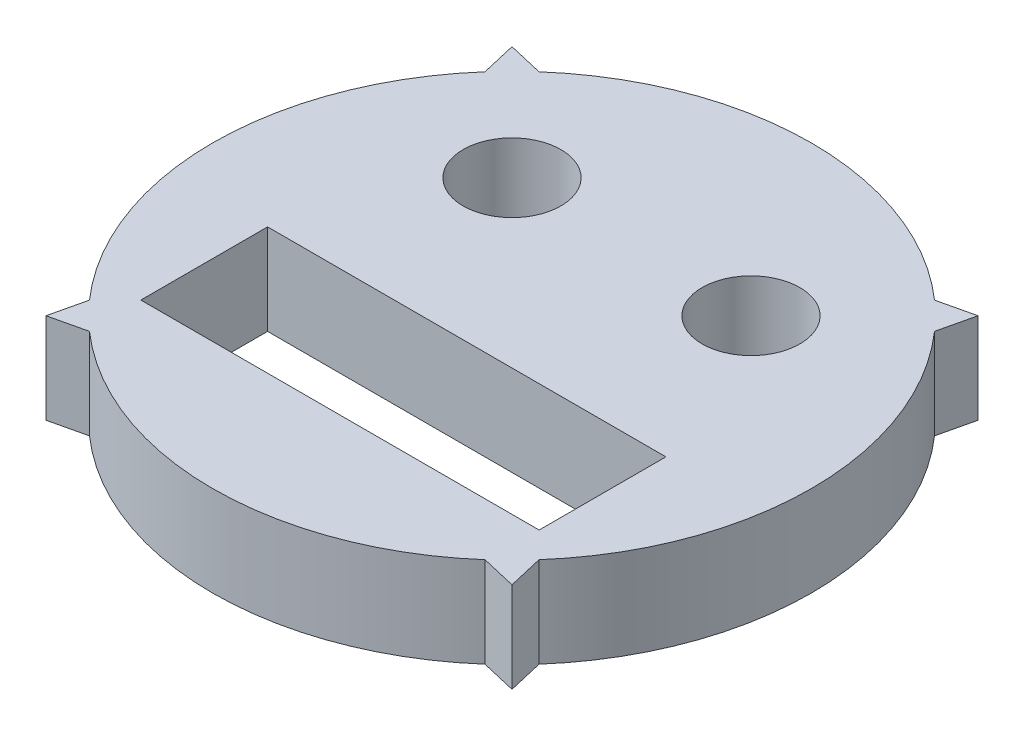
ISO-10303-21;
HEADER;
FILE_DESCRIPTION(('STEP AP214'),'2;1');
FILE_NAME('part.step','',(''),(''),'','','');
FILE_SCHEMA(('AUTOMOTIVE_DESIGN { 1 0 10303 214 1 1 1 1 }'));
ENDSEC;
DATA;
#1=APPLICATION_CONTEXT('core data for automotive mechanical design processes');
#2=APPLICATION_PROTOCOL_DEFINITION('international standard','automotive_design',2000,#1);
#3=PRODUCT_CONTEXT('',#1,'mechanical');
#4=PRODUCT('Part','Part','',(#3));
#5=PRODUCT_RELATED_PRODUCT_CATEGORY('part','',(#4));
#6=PRODUCT_DEFINITION_FORMATION('','',#4);
#7=PRODUCT_DEFINITION_CONTEXT('part definition',#1,'design');
#8=PRODUCT_DEFINITION('design','',#6,#7);
#9=PRODUCT_DEFINITION_SHAPE('','',#8);
#10=(LENGTH_UNIT() NAMED_UNIT(*) SI_UNIT(.MILLI.,.METRE.));
#11=(NAMED_UNIT(*) PLANE_ANGLE_UNIT() SI_UNIT($,.RADIAN.));
#12=(NAMED_UNIT(*) SI_UNIT($,.STERADIAN.) SOLID_ANGLE_UNIT());
#13=UNCERTAINTY_MEASURE_WITH_UNIT(LENGTH_MEASURE(1.E-05),#10,'distance_accuracy_value','');
#14=(GEOMETRIC_REPRESENTATION_CONTEXT(3) GLOBAL_UNCERTAINTY_ASSIGNED_CONTEXT((#13)) GLOBAL_UNIT_ASSIGNED_CONTEXT((#10,
#11,#12)) REPRESENTATION_CONTEXT('',''));
#15=CARTESIAN_POINT('',(0.,0.,0.));
#16=DIRECTION('',(0.,0.,1.));
#17=DIRECTION('',(1.,0.,0.));
#18=AXIS2_PLACEMENT_3D('',#15,#16,#17);
#19=CARTESIAN_POINT('',(0.,6.35,0.));
#20=DIRECTION('',(0.,1.,0.));
#21=DIRECTION('',(0.,0.,1.));
#22=AXIS2_PLACEMENT_3D('',#19,#20,#21);
#23=PLANE('',#22);
#24=CARTESIAN_POINT('',(-8.382,6.35,-8.382));
#25=DIRECTION('',(0.,1.,0.));
#26=DIRECTION('',(0.,0.,1.));
#27=AXIS2_PLACEMENT_3D('',#24,#25,#26);
#28=CIRCLE('',#27,3.429);
#29=CARTESIAN_POINT('',(-8.382,6.35,-4.953));
#30=VERTEX_POINT('',#29);
#31=EDGE_CURVE('E195',#30,#30,#28,.T.);
#32=ORIENTED_EDGE('',*,*,#31,.F.);
#33=EDGE_LOOP('',(#32));
#34=FACE_BOUND('',#33,.T.);
#35=CARTESIAN_POINT('',(0.,6.35,0.));
#36=DIRECTION('',(0.,1.,0.));
#37=DIRECTION('',(0.,0.,1.));
#38=AXIS2_PLACEMENT_3D('',#35,#36,#37);
#39=CIRCLE('',#38,21.);
#40=CARTESIAN_POINT('',(13.8700852365894,6.35,-15.767711803865));
#41=VERTEX_POINT('',#40);
#42=CARTESIAN_POINT('',(-13.8700852365893,6.35,-15.7677118038652));
#43=VERTEX_POINT('',#42);
#44=EDGE_CURVE('E205',#41,#43,#39,.T.);
#45=ORIENTED_EDGE('',*,*,#44,.T.);
#46=DIRECTION('',(-0.973932989200464,0.,-0.22683591546986));
#47=VECTOR('',#46,1.);
#48=CARTESIAN_POINT('',(-16.3438750291584,6.35,-16.3438750291586));
#49=LINE('',#48,#47);
#50=CARTESIAN_POINT('',(-16.3438750291584,6.35,-16.3438750291586));
#51=VERTEX_POINT('',#50);
#52=EDGE_CURVE('E210',#43,#51,#49,.T.);
#53=ORIENTED_EDGE('',*,*,#52,.T.);
#54=DIRECTION('',(0.22683591546985,0.,0.973932989200466));
#55=VECTOR('',#54,1.);
#56=CARTESIAN_POINT('',(-15.767711803865,6.35,-13.8700852365894));
#57=LINE('',#56,#55);
#58=CARTESIAN_POINT('',(-15.767711803865,6.35,-13.8700852365894));
#59=VERTEX_POINT('',#58);
#60=EDGE_CURVE('E222',#51,#59,#57,.T.);
#61=ORIENTED_EDGE('',*,*,#60,.T.);
#62=CARTESIAN_POINT('',(0.,6.35,0.));
#63=DIRECTION('',(0.,1.,0.));
#64=DIRECTION('',(0.,0.,1.));
#65=AXIS2_PLACEMENT_3D('',#62,#63,#64);
#66=CIRCLE('',#65,21.);
#67=CARTESIAN_POINT('',(-15.7677118038652,6.35,13.8700852365893));
#68=VERTEX_POINT('',#67);
#69=EDGE_CURVE('E225',#59,#68,#66,.T.);
#70=ORIENTED_EDGE('',*,*,#69,.T.);
#71=DIRECTION('',(-0.226835915469858,0.,0.973932989200464));
#72=VECTOR('',#71,1.);
#73=CARTESIAN_POINT('',(-16.3438750291586,6.35,16.3438750291584));
#74=LINE('',#73,#72);
#75=CARTESIAN_POINT('',(-16.3438750291586,6.35,16.3438750291584));
#76=VERTEX_POINT('',#75);
#77=EDGE_CURVE('E229',#68,#76,#74,.T.);
#78=ORIENTED_EDGE('',*,*,#77,.T.);
#79=DIRECTION('',(0.973932989200466,0.,-0.22683591546985));
#80=VECTOR('',#79,1.);
#81=CARTESIAN_POINT('',(-13.8700852365894,6.35,15.767711803865));
#82=LINE('',#81,#80);
#83=CARTESIAN_POINT('',(-13.8700852365894,6.35,15.767711803865));
#84=VERTEX_POINT('',#83);
#85=EDGE_CURVE('E233',#76,#84,#82,.T.);
#86=ORIENTED_EDGE('',*,*,#85,.T.);
#87=CARTESIAN_POINT('',(0.,6.35,0.));
#88=DIRECTION('',(0.,1.,0.));
#89=DIRECTION('',(0.,0.,1.));
#90=AXIS2_PLACEMENT_3D('',#87,#88,#89);
#91=CIRCLE('',#90,21.);
#92=CARTESIAN_POINT('',(13.8700852365893,6.35,15.7677118038652));
#93=VERTEX_POINT('',#92);
#94=EDGE_CURVE('E241',#84,#93,#91,.T.);
#95=ORIENTED_EDGE('',*,*,#94,.T.);
#96=DIRECTION('',(0.973932989200464,0.,0.226835915469859));
#97=VECTOR('',#96,1.);
#98=CARTESIAN_POINT('',(16.3438750291584,6.35,16.3438750291586));
#99=LINE('',#98,#97);
#100=CARTESIAN_POINT('',(16.3438750291584,6.35,16.3438750291586));
#101=VERTEX_POINT('',#100);
#102=EDGE_CURVE('E244',#93,#101,#99,.T.);
#103=ORIENTED_EDGE('',*,*,#102,.T.);
#104=DIRECTION('',(-0.226835915469849,0.,-0.973932989200466));
#105=VECTOR('',#104,1.);
#106=CARTESIAN_POINT('',(15.767711803865,6.35,13.8700852365894));
#107=LINE('',#106,#105);
#108=CARTESIAN_POINT('',(15.767711803865,6.35,13.8700852365894));
#109=VERTEX_POINT('',#108);
#110=EDGE_CURVE('E248',#101,#109,#107,.T.);
#111=ORIENTED_EDGE('',*,*,#110,.T.);
#112=CARTESIAN_POINT('',(0.,6.35,0.));
#113=DIRECTION('',(0.,1.,0.));
#114=DIRECTION('',(0.,0.,1.));
#115=AXIS2_PLACEMENT_3D('',#112,#113,#114);
#116=CIRCLE('',#115,21.);
#117=CARTESIAN_POINT('',(15.7677118038652,6.35,-13.8700852365893));
#118=VERTEX_POINT('',#117);
#119=EDGE_CURVE('E252',#109,#118,#116,.T.);
#120=ORIENTED_EDGE('',*,*,#119,.T.);
#121=DIRECTION('',(0.226835915469859,0.,-0.973932989200464));
#122=VECTOR('',#121,1.);
#123=CARTESIAN_POINT('',(16.3438750291586,6.35,-16.3438750291584));
#124=LINE('',#123,#122);
#125=CARTESIAN_POINT('',(16.3438750291586,6.35,-16.3438750291584));
#126=VERTEX_POINT('',#125);
#127=EDGE_CURVE('E256',#118,#126,#124,.T.);
#128=ORIENTED_EDGE('',*,*,#127,.T.);
#129=DIRECTION('',(-0.973932989200466,0.,0.226835915469849));
#130=VECTOR('',#129,1.);
#131=CARTESIAN_POINT('',(13.8700852365894,6.35,-15.767711803865));
#132=LINE('',#131,#130);
#133=EDGE_CURVE('E259',#126,#41,#132,.T.);
#134=ORIENTED_EDGE('',*,*,#133,.T.);
#135=EDGE_LOOP('',(#45,#53,#61,#70,#78,#86,#95,#103,#111,#120,#128,#134));
#136=FACE_BOUND('',#135,.T.);
#137=DIRECTION('',(1.,0.,0.));
#138=VECTOR('',#137,1.);
#139=CARTESIAN_POINT('',(-13.97,6.35,12.065));
#140=LINE('',#139,#138);
#141=CARTESIAN_POINT('',(-13.97,6.35,12.065));
#142=VERTEX_POINT('',#141);
#143=CARTESIAN_POINT('',(13.97,6.35,12.065));
#144=VERTEX_POINT('',#143);
#145=EDGE_CURVE('E160',#142,#144,#140,.T.);
#146=ORIENTED_EDGE('',*,*,#145,.F.);
#147=DIRECTION('',(0.,0.,1.));
#148=VECTOR('',#147,1.);
#149=CARTESIAN_POINT('',(-13.97,6.35,3.175));
#150=LINE('',#149,#148);
#151=CARTESIAN_POINT('',(-13.97,6.35,3.175));
#152=VERTEX_POINT('',#151);
#153=EDGE_CURVE('E151',#152,#142,#150,.T.);
#154=ORIENTED_EDGE('',*,*,#153,.F.);
#155=DIRECTION('',(-1.,0.,0.));
#156=VECTOR('',#155,1.);
#157=CARTESIAN_POINT('',(-13.97,6.35,3.175));
#158=LINE('',#157,#156);
#159=CARTESIAN_POINT('',(13.97,6.35,3.175));
#160=VERTEX_POINT('',#159);
#161=EDGE_CURVE('E178',#160,#152,#158,.T.);
#162=ORIENTED_EDGE('',*,*,#161,.F.);
#163=DIRECTION('',(0.,0.,-1.));
#164=VECTOR('',#163,1.);
#165=CARTESIAN_POINT('',(13.97,6.35,3.175));
#166=LINE('',#165,#164);
#167=EDGE_CURVE('E173',#144,#160,#166,.T.);
#168=ORIENTED_EDGE('',*,*,#167,.F.);
#169=EDGE_LOOP('',(#146,#154,#162,#168));
#170=FACE_BOUND('',#169,.T.);
#171=CARTESIAN_POINT('',(8.382,6.35,-8.382));
#172=DIRECTION('',(0.,1.,0.));
#173=DIRECTION('',(0.,0.,1.));
#174=AXIS2_PLACEMENT_3D('',#171,#172,#173);
#175=CIRCLE('',#174,3.429);
#176=CARTESIAN_POINT('',(8.382,6.35,-4.953));
#177=VERTEX_POINT('',#176);
#178=EDGE_CURVE('E543',#177,#177,#175,.T.);
#179=ORIENTED_EDGE('',*,*,#178,.F.);
#180=EDGE_LOOP('',(#179));
#181=FACE_BOUND('',#180,.T.);
#182=ADVANCED_FACE('F38',(#34,#136,#170,#181),#23,.T.);
#183=CARTESIAN_POINT('',(0.,0.,0.));
#184=DIRECTION('',(0.,1.,0.));
#185=DIRECTION('',(0.,0.,1.));
#186=AXIS2_PLACEMENT_3D('',#183,#184,#185);
#187=PLANE('',#186);
#188=CARTESIAN_POINT('',(0.,0.,0.));
#189=DIRECTION('',(0.,1.,0.));
#190=DIRECTION('',(0.,0.,1.));
#191=AXIS2_PLACEMENT_3D('',#188,#189,#190);
#192=CIRCLE('',#191,21.);
#193=CARTESIAN_POINT('',(13.8700852365894,0.,-15.767711803865));
#194=VERTEX_POINT('',#193);
#195=CARTESIAN_POINT('',(-13.8700852365893,0.,-15.7677118038652));
#196=VERTEX_POINT('',#195);
#197=EDGE_CURVE('E168',#194,#196,#192,.T.);
#198=ORIENTED_EDGE('',*,*,#197,.F.);
#199=DIRECTION('',(-0.973932989200466,0.,0.226835915469849));
#200=VECTOR('',#199,1.);
#201=CARTESIAN_POINT('',(13.8700852365894,0.,-15.767711803865));
#202=LINE('',#201,#200);
#203=CARTESIAN_POINT('',(16.3438750291586,0.,-16.3438750291584));
#204=VERTEX_POINT('',#203);
#205=EDGE_CURVE('E211',#204,#194,#202,.T.);
#206=ORIENTED_EDGE('',*,*,#205,.F.);
#207=DIRECTION('',(0.226835915469859,0.,-0.973932989200464));
#208=VECTOR('',#207,1.);
#209=CARTESIAN_POINT('',(16.3438750291586,0.,-16.3438750291584));
#210=LINE('',#209,#208);
#211=CARTESIAN_POINT('',(15.7677118038652,0.,-13.8700852365893));
#212=VERTEX_POINT('',#211);
#213=EDGE_CURVE('E283',#212,#204,#210,.T.);
#214=ORIENTED_EDGE('',*,*,#213,.F.);
#215=CARTESIAN_POINT('',(0.,0.,0.));
#216=DIRECTION('',(0.,1.,0.));
#217=DIRECTION('',(0.,0.,1.));
#218=AXIS2_PLACEMENT_3D('',#215,#216,#217);
#219=CIRCLE('',#218,21.);
#220=CARTESIAN_POINT('',(15.767711803865,0.,13.8700852365894));
#221=VERTEX_POINT('',#220);
#222=EDGE_CURVE('E281',#221,#212,#219,.T.);
#223=ORIENTED_EDGE('',*,*,#222,.F.);
#224=DIRECTION('',(-0.226835915469849,0.,-0.973932989200466));
#225=VECTOR('',#224,1.);
#226=CARTESIAN_POINT('',(15.767711803865,0.,13.8700852365894));
#227=LINE('',#226,#225);
#228=CARTESIAN_POINT('',(16.3438750291584,0.,16.3438750291586));
#229=VERTEX_POINT('',#228);
#230=EDGE_CURVE('E279',#229,#221,#227,.T.);
#231=ORIENTED_EDGE('',*,*,#230,.F.);
#232=DIRECTION('',(0.973932989200464,0.,0.226835915469859));
#233=VECTOR('',#232,1.);
#234=CARTESIAN_POINT('',(16.3438750291584,0.,16.3438750291586));
#235=LINE('',#234,#233);
#236=CARTESIAN_POINT('',(13.8700852365893,0.,15.7677118038652));
#237=VERTEX_POINT('',#236);
#238=EDGE_CURVE('E277',#237,#229,#235,.T.);
#239=ORIENTED_EDGE('',*,*,#238,.F.);
#240=CARTESIAN_POINT('',(0.,0.,0.));
#241=DIRECTION('',(0.,1.,0.));
#242=DIRECTION('',(0.,0.,1.));
#243=AXIS2_PLACEMENT_3D('',#240,#241,#242);
#244=CIRCLE('',#243,21.);
#245=CARTESIAN_POINT('',(-13.8700852365894,0.,15.767711803865));
#246=VERTEX_POINT('',#245);
#247=EDGE_CURVE('E275',#246,#237,#244,.T.);
#248=ORIENTED_EDGE('',*,*,#247,.F.);
#249=DIRECTION('',(0.973932989200466,0.,-0.22683591546985));
#250=VECTOR('',#249,1.);
#251=CARTESIAN_POINT('',(-13.8700852365894,0.,15.767711803865));
#252=LINE('',#251,#250);
#253=CARTESIAN_POINT('',(-16.3438750291586,0.,16.3438750291584));
#254=VERTEX_POINT('',#253);
#255=EDGE_CURVE('E273',#254,#246,#252,.T.);
#256=ORIENTED_EDGE('',*,*,#255,.F.);
#257=DIRECTION('',(-0.226835915469858,0.,0.973932989200464));
#258=VECTOR('',#257,1.);
#259=CARTESIAN_POINT('',(-16.3438750291586,0.,16.3438750291584));
#260=LINE('',#259,#258);
#261=CARTESIAN_POINT('',(-15.7677118038652,0.,13.8700852365893));
#262=VERTEX_POINT('',#261);
#263=EDGE_CURVE('E271',#262,#254,#260,.T.);
#264=ORIENTED_EDGE('',*,*,#263,.F.);
#265=CARTESIAN_POINT('',(0.,0.,0.));
#266=DIRECTION('',(0.,1.,0.));
#267=DIRECTION('',(0.,0.,1.));
#268=AXIS2_PLACEMENT_3D('',#265,#266,#267);
#269=CIRCLE('',#268,21.);
#270=CARTESIAN_POINT('',(-15.767711803865,0.,-13.8700852365894));
#271=VERTEX_POINT('',#270);
#272=EDGE_CURVE('E269',#271,#262,#269,.T.);
#273=ORIENTED_EDGE('',*,*,#272,.F.);
#274=DIRECTION('',(0.22683591546985,0.,0.973932989200466));
#275=VECTOR('',#274,1.);
#276=CARTESIAN_POINT('',(-15.767711803865,0.,-13.8700852365894));
#277=LINE('',#276,#275);
#278=CARTESIAN_POINT('',(-16.3438750291584,0.,-16.3438750291586));
#279=VERTEX_POINT('',#278);
#280=EDGE_CURVE('E267',#279,#271,#277,.T.);
#281=ORIENTED_EDGE('',*,*,#280,.F.);
#282=DIRECTION('',(-0.973932989200464,0.,-0.22683591546986));
#283=VECTOR('',#282,1.);
#284=CARTESIAN_POINT('',(-16.3438750291584,0.,-16.3438750291586));
#285=LINE('',#284,#283);
#286=EDGE_CURVE('E265',#196,#279,#285,.T.);
#287=ORIENTED_EDGE('',*,*,#286,.F.);
#288=EDGE_LOOP('',(#198,#206,#214,#223,#231,#239,#248,#256,#264,#273,#281,#287));
#289=FACE_BOUND('',#288,.T.);
#290=DIRECTION('',(0.,0.,1.));
#291=VECTOR('',#290,1.);
#292=CARTESIAN_POINT('',(-13.97,0.,3.175));
#293=LINE('',#292,#291);
#294=CARTESIAN_POINT('',(-13.97,0.,3.175));
#295=VERTEX_POINT('',#294);
#296=CARTESIAN_POINT('',(-13.97,0.,12.065));
#297=VERTEX_POINT('',#296);
#298=EDGE_CURVE('E61',#295,#297,#293,.T.);
#299=ORIENTED_EDGE('',*,*,#298,.T.);
#300=DIRECTION('',(1.,0.,0.));
#301=VECTOR('',#300,1.);
#302=CARTESIAN_POINT('',(-13.97,0.,12.065));
#303=LINE('',#302,#301);
#304=CARTESIAN_POINT('',(13.97,0.,12.065));
#305=VERTEX_POINT('',#304);
#306=EDGE_CURVE('E167',#297,#305,#303,.T.);
#307=ORIENTED_EDGE('',*,*,#306,.T.);
#308=DIRECTION('',(0.,0.,-1.));
#309=VECTOR('',#308,1.);
#310=CARTESIAN_POINT('',(13.97,0.,3.175));
#311=LINE('',#310,#309);
#312=CARTESIAN_POINT('',(13.97,0.,3.175));
#313=VERTEX_POINT('',#312);
#314=EDGE_CURVE('E197',#305,#313,#311,.T.);
#315=ORIENTED_EDGE('',*,*,#314,.T.);
#316=DIRECTION('',(-1.,0.,0.));
#317=VECTOR('',#316,1.);
#318=CARTESIAN_POINT('',(-13.97,0.,3.175));
#319=LINE('',#318,#317);
#320=EDGE_CURVE('E161',#313,#295,#319,.T.);
#321=ORIENTED_EDGE('',*,*,#320,.T.);
#322=EDGE_LOOP('',(#299,#307,#315,#321));
#323=FACE_BOUND('',#322,.T.);
#324=CARTESIAN_POINT('',(-8.382,0.,-8.382));
#325=DIRECTION('',(0.,1.,0.));
#326=DIRECTION('',(0.,0.,1.));
#327=AXIS2_PLACEMENT_3D('',#324,#325,#326);
#328=CIRCLE('',#327,3.429);
#329=CARTESIAN_POINT('',(-8.382,0.,-4.953));
#330=VERTEX_POINT('',#329);
#331=EDGE_CURVE('E550',#330,#330,#328,.T.);
#332=ORIENTED_EDGE('',*,*,#331,.T.);
#333=EDGE_LOOP('',(#332));
#334=FACE_BOUND('',#333,.T.);
#335=CARTESIAN_POINT('',(8.382,0.,-8.382));
#336=DIRECTION('',(0.,1.,0.));
#337=DIRECTION('',(0.,0.,1.));
#338=AXIS2_PLACEMENT_3D('',#335,#336,#337);
#339=CIRCLE('',#338,3.429);
#340=CARTESIAN_POINT('',(8.382,0.,-4.953));
#341=VERTEX_POINT('',#340);
#342=EDGE_CURVE('E546',#341,#341,#339,.T.);
#343=ORIENTED_EDGE('',*,*,#342,.T.);
#344=EDGE_LOOP('',(#343));
#345=FACE_BOUND('',#344,.T.);
#346=ADVANCED_FACE('F325',(#289,#323,#334,#345),#187,.F.);
#347=CARTESIAN_POINT('',(0.,6.35,0.));
#348=DIRECTION('',(0.,-1.,0.));
#349=DIRECTION('',(0.,0.,-1.));
#350=AXIS2_PLACEMENT_3D('',#347,#348,#349);
#351=CYLINDRICAL_SURFACE('',#350,21.);
#352=ORIENTED_EDGE('',*,*,#197,.T.);
#353=DIRECTION('',(0.,-1.,0.));
#354=VECTOR('',#353,1.);
#355=CARTESIAN_POINT('',(-13.8700852365893,6.35,-15.7677118038652));
#356=LINE('',#355,#354);
#357=EDGE_CURVE('E12',#43,#196,#356,.T.);
#358=ORIENTED_EDGE('',*,*,#357,.F.);
#359=ORIENTED_EDGE('',*,*,#44,.F.);
#360=DIRECTION('',(0.,-1.,0.));
#361=VECTOR('',#360,1.);
#362=CARTESIAN_POINT('',(13.8700852365894,6.35,-15.767711803865));
#363=LINE('',#362,#361);
#364=EDGE_CURVE('E262',#41,#194,#363,.T.);
#365=ORIENTED_EDGE('',*,*,#364,.T.);
#366=EDGE_LOOP('',(#352,#358,#359,#365));
#367=FACE_BOUND('',#366,.T.);
#368=ADVANCED_FACE('F40',(#367),#351,.T.);
#369=CARTESIAN_POINT('',(-16.3438750291584,6.35,-16.3438750291586));
#370=DIRECTION('',(-0.22683591546986,0.,0.973932989200464));
#371=DIRECTION('',(0.973932989200464,0.,0.22683591546986));
#372=AXIS2_PLACEMENT_3D('',#369,#370,#371);
#373=PLANE('',#372);
#374=ORIENTED_EDGE('',*,*,#286,.T.);
#375=DIRECTION('',(0.,-1.,0.));
#376=VECTOR('',#375,1.);
#377=CARTESIAN_POINT('',(-16.3438750291584,6.35,-16.3438750291586));
#378=LINE('',#377,#376);
#379=EDGE_CURVE('E46',#51,#279,#378,.T.);
#380=ORIENTED_EDGE('',*,*,#379,.F.);
#381=ORIENTED_EDGE('',*,*,#52,.F.);
#382=ORIENTED_EDGE('',*,*,#357,.T.);
#383=EDGE_LOOP('',(#374,#380,#381,#382));
#384=FACE_BOUND('',#383,.T.);
#385=ADVANCED_FACE('F364',(#384),#373,.F.);
#386=CARTESIAN_POINT('',(-15.767711803865,6.35,-13.8700852365894));
#387=DIRECTION('',(0.973932989200466,0.,-0.22683591546985));
#388=DIRECTION('',(-0.22683591546985,0.,-0.973932989200466));
#389=AXIS2_PLACEMENT_3D('',#386,#387,#388);
#390=PLANE('',#389);
#391=ORIENTED_EDGE('',*,*,#280,.T.);
#392=DIRECTION('',(0.,-1.,0.));
#393=VECTOR('',#392,1.);
#394=CARTESIAN_POINT('',(-15.767711803865,6.35,-13.8700852365894));
#395=LINE('',#394,#393);
#396=EDGE_CURVE('E312',#59,#271,#395,.T.);
#397=ORIENTED_EDGE('',*,*,#396,.F.);
#398=ORIENTED_EDGE('',*,*,#60,.F.);
#399=ORIENTED_EDGE('',*,*,#379,.T.);
#400=EDGE_LOOP('',(#391,#397,#398,#399));
#401=FACE_BOUND('',#400,.T.);
#402=ADVANCED_FACE('F319',(#401),#390,.F.);
#403=CARTESIAN_POINT('',(0.,6.35,0.));
#404=DIRECTION('',(0.,-1.,0.));
#405=DIRECTION('',(0.,0.,-1.));
#406=AXIS2_PLACEMENT_3D('',#403,#404,#405);
#407=CYLINDRICAL_SURFACE('',#406,21.);
#408=ORIENTED_EDGE('',*,*,#272,.T.);
#409=DIRECTION('',(0.,-1.,0.));
#410=VECTOR('',#409,1.);
#411=CARTESIAN_POINT('',(-15.7677118038652,6.35,13.8700852365893));
#412=LINE('',#411,#410);
#413=EDGE_CURVE('E309',#68,#262,#412,.T.);
#414=ORIENTED_EDGE('',*,*,#413,.F.);
#415=ORIENTED_EDGE('',*,*,#69,.F.);
#416=ORIENTED_EDGE('',*,*,#396,.T.);
#417=EDGE_LOOP('',(#408,#414,#415,#416));
#418=FACE_BOUND('',#417,.T.);
#419=ADVANCED_FACE('F331',(#418),#407,.T.);
#420=CARTESIAN_POINT('',(-16.3438750291586,6.35,16.3438750291584));
#421=DIRECTION('',(0.973932989200464,0.,0.226835915469858));
#422=DIRECTION('',(0.226835915469858,0.,-0.973932989200464));
#423=AXIS2_PLACEMENT_3D('',#420,#421,#422);
#424=PLANE('',#423);
#425=ORIENTED_EDGE('',*,*,#263,.T.);
#426=DIRECTION('',(0.,-1.,0.));
#427=VECTOR('',#426,1.);
#428=CARTESIAN_POINT('',(-16.3438750291586,6.35,16.3438750291584));
#429=LINE('',#428,#427);
#430=EDGE_CURVE('E306',#76,#254,#429,.T.);
#431=ORIENTED_EDGE('',*,*,#430,.F.);
#432=ORIENTED_EDGE('',*,*,#77,.F.);
#433=ORIENTED_EDGE('',*,*,#413,.T.);
#434=EDGE_LOOP('',(#425,#431,#432,#433));
#435=FACE_BOUND('',#434,.T.);
#436=ADVANCED_FACE('F335',(#435),#424,.F.);
#437=CARTESIAN_POINT('',(-13.8700852365894,6.35,15.767711803865));
#438=DIRECTION('',(-0.22683591546985,0.,-0.973932989200466));
#439=DIRECTION('',(-0.973932989200466,0.,0.22683591546985));
#440=AXIS2_PLACEMENT_3D('',#437,#438,#439);
#441=PLANE('',#440);
#442=ORIENTED_EDGE('',*,*,#255,.T.);
#443=DIRECTION('',(0.,-1.,0.));
#444=VECTOR('',#443,1.);
#445=CARTESIAN_POINT('',(-13.8700852365894,6.35,15.767711803865));
#446=LINE('',#445,#444);
#447=EDGE_CURVE('E303',#84,#246,#446,.T.);
#448=ORIENTED_EDGE('',*,*,#447,.F.);
#449=ORIENTED_EDGE('',*,*,#85,.F.);
#450=ORIENTED_EDGE('',*,*,#430,.T.);
#451=EDGE_LOOP('',(#442,#448,#449,#450));
#452=FACE_BOUND('',#451,.T.);
#453=ADVANCED_FACE('F399',(#452),#441,.F.);
#454=CARTESIAN_POINT('',(0.,6.35,0.));
#455=DIRECTION('',(0.,-1.,0.));
#456=DIRECTION('',(0.,0.,-1.));
#457=AXIS2_PLACEMENT_3D('',#454,#455,#456);
#458=CYLINDRICAL_SURFACE('',#457,21.);
#459=ORIENTED_EDGE('',*,*,#247,.T.);
#460=DIRECTION('',(0.,-1.,0.));
#461=VECTOR('',#460,1.);
#462=CARTESIAN_POINT('',(13.8700852365893,6.35,15.7677118038652));
#463=LINE('',#462,#461);
#464=EDGE_CURVE('E300',#93,#237,#463,.T.);
#465=ORIENTED_EDGE('',*,*,#464,.F.);
#466=ORIENTED_EDGE('',*,*,#94,.F.);
#467=ORIENTED_EDGE('',*,*,#447,.T.);
#468=EDGE_LOOP('',(#459,#465,#466,#467));
#469=FACE_BOUND('',#468,.T.);
#470=ADVANCED_FACE('F395',(#469),#458,.T.);
#471=CARTESIAN_POINT('',(16.3438750291584,6.35,16.3438750291586));
#472=DIRECTION('',(0.226835915469859,0.,-0.973932989200464));
#473=DIRECTION('',(-0.973932989200464,0.,-0.226835915469859));
#474=AXIS2_PLACEMENT_3D('',#471,#472,#473);
#475=PLANE('',#474);
#476=ORIENTED_EDGE('',*,*,#238,.T.);
#477=DIRECTION('',(0.,-1.,0.));
#478=VECTOR('',#477,1.);
#479=CARTESIAN_POINT('',(16.3438750291584,6.35,16.3438750291586));
#480=LINE('',#479,#478);
#481=EDGE_CURVE('E297',#101,#229,#480,.T.);
#482=ORIENTED_EDGE('',*,*,#481,.F.);
#483=ORIENTED_EDGE('',*,*,#102,.F.);
#484=ORIENTED_EDGE('',*,*,#464,.T.);
#485=EDGE_LOOP('',(#476,#482,#483,#484));
#486=FACE_BOUND('',#485,.T.);
#487=ADVANCED_FACE('F391',(#486),#475,.F.);
#488=CARTESIAN_POINT('',(15.767711803865,6.35,13.8700852365894));
#489=DIRECTION('',(-0.973932989200466,0.,0.226835915469849));
#490=DIRECTION('',(0.226835915469849,0.,0.973932989200466));
#491=AXIS2_PLACEMENT_3D('',#488,#489,#490);
#492=PLANE('',#491);
#493=ORIENTED_EDGE('',*,*,#230,.T.);
#494=DIRECTION('',(0.,-1.,0.));
#495=VECTOR('',#494,1.);
#496=CARTESIAN_POINT('',(15.767711803865,6.35,13.8700852365894));
#497=LINE('',#496,#495);
#498=EDGE_CURVE('E294',#109,#221,#497,.T.);
#499=ORIENTED_EDGE('',*,*,#498,.F.);
#500=ORIENTED_EDGE('',*,*,#110,.F.);
#501=ORIENTED_EDGE('',*,*,#481,.T.);
#502=EDGE_LOOP('',(#493,#499,#500,#501));
#503=FACE_BOUND('',#502,.T.);
#504=ADVANCED_FACE('F388',(#503),#492,.F.);
#505=CARTESIAN_POINT('',(0.,6.35,0.));
#506=DIRECTION('',(0.,-1.,0.));
#507=DIRECTION('',(0.,0.,-1.));
#508=AXIS2_PLACEMENT_3D('',#505,#506,#507);
#509=CYLINDRICAL_SURFACE('',#508,21.);
#510=ORIENTED_EDGE('',*,*,#222,.T.);
#511=DIRECTION('',(0.,-1.,0.));
#512=VECTOR('',#511,1.);
#513=CARTESIAN_POINT('',(15.7677118038652,6.35,-13.8700852365893));
#514=LINE('',#513,#512);
#515=EDGE_CURVE('E291',#118,#212,#514,.T.);
#516=ORIENTED_EDGE('',*,*,#515,.F.);
#517=ORIENTED_EDGE('',*,*,#119,.F.);
#518=ORIENTED_EDGE('',*,*,#498,.T.);
#519=EDGE_LOOP('',(#510,#516,#517,#518));
#520=FACE_BOUND('',#519,.T.);
#521=ADVANCED_FACE('F353',(#520),#509,.T.);
#522=CARTESIAN_POINT('',(16.3438750291586,6.35,-16.3438750291584));
#523=DIRECTION('',(-0.973932989200464,0.,-0.226835915469859));
#524=DIRECTION('',(-0.226835915469859,0.,0.973932989200464));
#525=AXIS2_PLACEMENT_3D('',#522,#523,#524);
#526=PLANE('',#525);
#527=ORIENTED_EDGE('',*,*,#213,.T.);
#528=DIRECTION('',(0.,-1.,0.));
#529=VECTOR('',#528,1.);
#530=CARTESIAN_POINT('',(16.3438750291586,6.35,-16.3438750291584));
#531=LINE('',#530,#529);
#532=EDGE_CURVE('E288',#126,#204,#531,.T.);
#533=ORIENTED_EDGE('',*,*,#532,.F.);
#534=ORIENTED_EDGE('',*,*,#127,.F.);
#535=ORIENTED_EDGE('',*,*,#515,.T.);
#536=EDGE_LOOP('',(#527,#533,#534,#535));
#537=FACE_BOUND('',#536,.T.);
#538=ADVANCED_FACE('F357',(#537),#526,.F.);
#539=CARTESIAN_POINT('',(13.8700852365894,6.35,-15.767711803865));
#540=DIRECTION('',(0.226835915469849,0.,0.973932989200466));
#541=DIRECTION('',(0.973932989200466,0.,-0.226835915469849));
#542=AXIS2_PLACEMENT_3D('',#539,#540,#541);
#543=PLANE('',#542);
#544=ORIENTED_EDGE('',*,*,#205,.T.);
#545=ORIENTED_EDGE('',*,*,#364,.F.);
#546=ORIENTED_EDGE('',*,*,#133,.F.);
#547=ORIENTED_EDGE('',*,*,#532,.T.);
#548=EDGE_LOOP('',(#544,#545,#546,#547));
#549=FACE_BOUND('',#548,.T.);
#550=ADVANCED_FACE('F362',(#549),#543,.F.);
#551=CARTESIAN_POINT('',(-13.97,6.35,3.175));
#552=DIRECTION('',(1.,0.,0.));
#553=DIRECTION('',(0.,0.,-1.));
#554=AXIS2_PLACEMENT_3D('',#551,#552,#553);
#555=PLANE('',#554);
#556=ORIENTED_EDGE('',*,*,#298,.F.);
#557=DIRECTION('',(0.,-1.,0.));
#558=VECTOR('',#557,1.);
#559=CARTESIAN_POINT('',(-13.97,6.35,3.175));
#560=LINE('',#559,#558);
#561=EDGE_CURVE('E155',#152,#295,#560,.T.);
#562=ORIENTED_EDGE('',*,*,#561,.F.);
#563=ORIENTED_EDGE('',*,*,#153,.T.);
#564=DIRECTION('',(0.,-1.,0.));
#565=VECTOR('',#564,1.);
#566=CARTESIAN_POINT('',(-13.97,6.35,12.065));
#567=LINE('',#566,#565);
#568=EDGE_CURVE('E154',#142,#297,#567,.T.);
#569=ORIENTED_EDGE('',*,*,#568,.T.);
#570=EDGE_LOOP('',(#556,#562,#563,#569));
#571=FACE_BOUND('',#570,.T.);
#572=ADVANCED_FACE('F153',(#571),#555,.T.);
#573=CARTESIAN_POINT('',(-13.97,6.35,12.065));
#574=DIRECTION('',(0.,0.,-1.));
#575=DIRECTION('',(-1.,0.,0.));
#576=AXIS2_PLACEMENT_3D('',#573,#574,#575);
#577=PLANE('',#576);
#578=ORIENTED_EDGE('',*,*,#306,.F.);
#579=ORIENTED_EDGE('',*,*,#568,.F.);
#580=ORIENTED_EDGE('',*,*,#145,.T.);
#581=DIRECTION('',(0.,-1.,0.));
#582=VECTOR('',#581,1.);
#583=CARTESIAN_POINT('',(13.97,6.35,12.065));
#584=LINE('',#583,#582);
#585=EDGE_CURVE('E169',#144,#305,#584,.T.);
#586=ORIENTED_EDGE('',*,*,#585,.T.);
#587=EDGE_LOOP('',(#578,#579,#580,#586));
#588=FACE_BOUND('',#587,.T.);
#589=ADVANCED_FACE('F164',(#588),#577,.T.);
#590=CARTESIAN_POINT('',(13.97,6.35,3.175));
#591=DIRECTION('',(-1.,0.,0.));
#592=DIRECTION('',(0.,0.,1.));
#593=AXIS2_PLACEMENT_3D('',#590,#591,#592);
#594=PLANE('',#593);
#595=ORIENTED_EDGE('',*,*,#314,.F.);
#596=ORIENTED_EDGE('',*,*,#585,.F.);
#597=ORIENTED_EDGE('',*,*,#167,.T.);
#598=DIRECTION('',(0.,-1.,0.));
#599=VECTOR('',#598,1.);
#600=CARTESIAN_POINT('',(13.97,6.35,3.175));
#601=LINE('',#600,#599);
#602=EDGE_CURVE('E53',#160,#313,#601,.T.);
#603=ORIENTED_EDGE('',*,*,#602,.T.);
#604=EDGE_LOOP('',(#595,#596,#597,#603));
#605=FACE_BOUND('',#604,.T.);
#606=ADVANCED_FACE('F454',(#605),#594,.T.);
#607=CARTESIAN_POINT('',(-13.97,6.35,3.175));
#608=DIRECTION('',(0.,0.,1.));
#609=DIRECTION('',(1.,0.,0.));
#610=AXIS2_PLACEMENT_3D('',#607,#608,#609);
#611=PLANE('',#610);
#612=ORIENTED_EDGE('',*,*,#320,.F.);
#613=ORIENTED_EDGE('',*,*,#602,.F.);
#614=ORIENTED_EDGE('',*,*,#161,.T.);
#615=ORIENTED_EDGE('',*,*,#561,.T.);
#616=EDGE_LOOP('',(#612,#613,#614,#615));
#617=FACE_BOUND('',#616,.T.);
#618=ADVANCED_FACE('F460',(#617),#611,.T.);
#619=CARTESIAN_POINT('',(-8.382,6.35,-8.382));
#620=DIRECTION('',(0.,-1.,0.));
#621=DIRECTION('',(0.,0.,-1.));
#622=AXIS2_PLACEMENT_3D('',#619,#620,#621);
#623=CYLINDRICAL_SURFACE('',#622,3.429);
#624=ORIENTED_EDGE('',*,*,#31,.T.);
#625=EDGE_LOOP('',(#624));
#626=FACE_BOUND('',#625,.T.);
#627=ORIENTED_EDGE('',*,*,#331,.F.);
#628=EDGE_LOOP('',(#627));
#629=FACE_BOUND('',#628,.T.);
#630=ADVANCED_FACE('F468',(#626,#629),#623,.F.);
#631=CARTESIAN_POINT('',(8.382,6.35,-8.382));
#632=DIRECTION('',(0.,-1.,0.));
#633=DIRECTION('',(0.,0.,-1.));
#634=AXIS2_PLACEMENT_3D('',#631,#632,#633);
#635=CYLINDRICAL_SURFACE('',#634,3.429);
#636=ORIENTED_EDGE('',*,*,#178,.T.);
#637=EDGE_LOOP('',(#636));
#638=FACE_BOUND('',#637,.T.);
#639=ORIENTED_EDGE('',*,*,#342,.F.);
#640=EDGE_LOOP('',(#639));
#641=FACE_BOUND('',#640,.T.);
#642=ADVANCED_FACE('F475',(#638,#641),#635,.F.);
#643=CLOSED_SHELL('',(#182,#346,#368,#385,#402,#419,#436,#453,#470,#487,#504,#521,#538,#550,
#572,#589,#606,#618,#630,#642));
#644=MANIFOLD_SOLID_BREP('B2',#643);
#645=ADVANCED_BREP_SHAPE_REPRESENTATION('',(#18,#644),#14);
#646=SHAPE_DEFINITION_REPRESENTATION(#9,#645);
ENDSEC;
END-ISO-10303-21;
